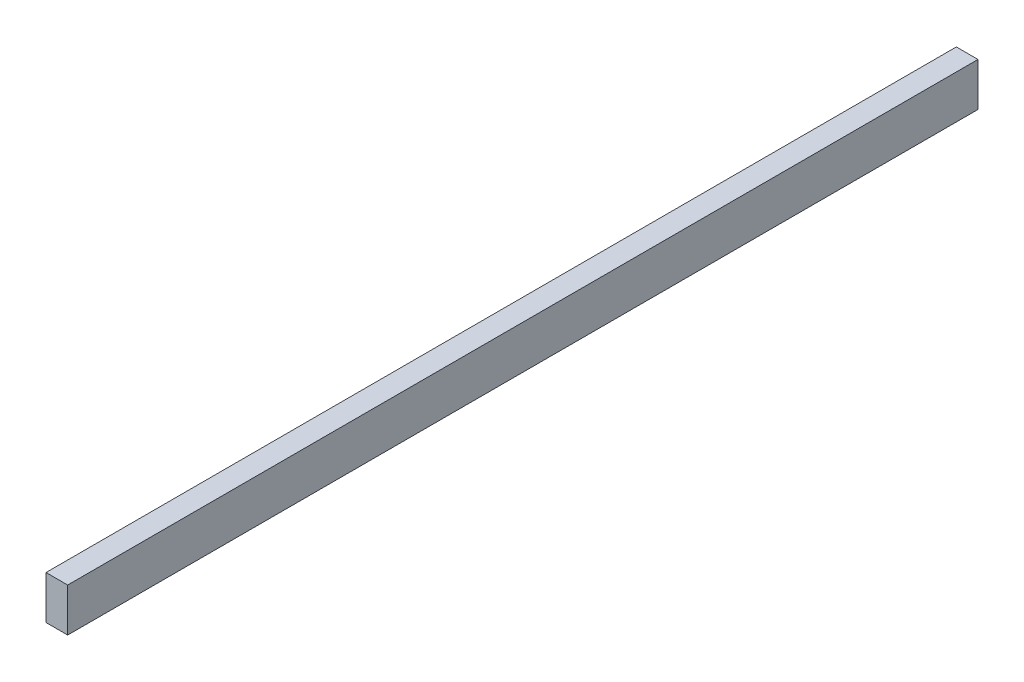
ISO-10303-21;
HEADER;
FILE_DESCRIPTION(('STEP AP214'),'2;1');
FILE_NAME('part.step','',(''),(''),'','','');
FILE_SCHEMA(('AUTOMOTIVE_DESIGN { 1 0 10303 214 1 1 1 1 }'));
ENDSEC;
DATA;
#1=APPLICATION_CONTEXT('core data for automotive mechanical design processes');
#2=APPLICATION_PROTOCOL_DEFINITION('international standard','automotive_design',2000,#1);
#3=PRODUCT_CONTEXT('',#1,'mechanical');
#4=PRODUCT('Part','Part','',(#3));
#5=PRODUCT_RELATED_PRODUCT_CATEGORY('part','',(#4));
#6=PRODUCT_DEFINITION_FORMATION('','',#4);
#7=PRODUCT_DEFINITION_CONTEXT('part definition',#1,'design');
#8=PRODUCT_DEFINITION('design','',#6,#7);
#9=PRODUCT_DEFINITION_SHAPE('','',#8);
#10=(LENGTH_UNIT() NAMED_UNIT(*) SI_UNIT(.MILLI.,.METRE.));
#11=(NAMED_UNIT(*) PLANE_ANGLE_UNIT() SI_UNIT($,.RADIAN.));
#12=(NAMED_UNIT(*) SI_UNIT($,.STERADIAN.) SOLID_ANGLE_UNIT());
#13=UNCERTAINTY_MEASURE_WITH_UNIT(LENGTH_MEASURE(1.E-05),#10,'distance_accuracy_value','');
#14=(GEOMETRIC_REPRESENTATION_CONTEXT(3) GLOBAL_UNCERTAINTY_ASSIGNED_CONTEXT((#13)) GLOBAL_UNIT_ASSIGNED_CONTEXT((#10,
#11,#12)) REPRESENTATION_CONTEXT('',''));
#15=CARTESIAN_POINT('',(0.,0.,0.));
#16=DIRECTION('',(0.,0.,1.));
#17=DIRECTION('',(1.,0.,0.));
#18=AXIS2_PLACEMENT_3D('',#15,#16,#17);
#19=CARTESIAN_POINT('',(25.4,-50.8,2133.6));
#20=DIRECTION('',(-1.,0.,0.));
#21=DIRECTION('',(0.,0.,1.));
#22=AXIS2_PLACEMENT_3D('',#19,#20,#21);
#23=PLANE('',#22);
#24=DIRECTION('',(0.,1.,0.));
#25=VECTOR('',#24,1.);
#26=CARTESIAN_POINT('',(25.4,-50.8,0.));
#27=LINE('',#26,#25);
#28=CARTESIAN_POINT('',(25.4,-50.8,0.));
#29=VERTEX_POINT('',#28);
#30=CARTESIAN_POINT('',(25.4,50.8,0.));
#31=VERTEX_POINT('',#30);
#32=EDGE_CURVE('E96',#29,#31,#27,.T.);
#33=ORIENTED_EDGE('',*,*,#32,.T.);
#34=DIRECTION('',(0.,0.,-1.));
#35=VECTOR('',#34,1.);
#36=CARTESIAN_POINT('',(25.4,50.8,2133.6));
#37=LINE('',#36,#35);
#38=CARTESIAN_POINT('',(25.4,50.8,2133.6));
#39=VERTEX_POINT('',#38);
#40=EDGE_CURVE('E11',#39,#31,#37,.T.);
#41=ORIENTED_EDGE('',*,*,#40,.F.);
#42=DIRECTION('',(0.,1.,0.));
#43=VECTOR('',#42,1.);
#44=CARTESIAN_POINT('',(25.4,-50.8,2133.6));
#45=LINE('',#44,#43);
#46=CARTESIAN_POINT('',(25.4,-50.8,2133.6));
#47=VERTEX_POINT('',#46);
#48=EDGE_CURVE('E84',#47,#39,#45,.T.);
#49=ORIENTED_EDGE('',*,*,#48,.F.);
#50=DIRECTION('',(0.,0.,-1.));
#51=VECTOR('',#50,1.);
#52=CARTESIAN_POINT('',(25.4,-50.8,2133.6));
#53=LINE('',#52,#51);
#54=EDGE_CURVE('E92',#47,#29,#53,.T.);
#55=ORIENTED_EDGE('',*,*,#54,.T.);
#56=EDGE_LOOP('',(#33,#41,#49,#55));
#57=FACE_BOUND('',#56,.T.);
#58=ADVANCED_FACE('F33',(#57),#23,.F.);
#59=CARTESIAN_POINT('',(-25.4,50.8,2133.6));
#60=DIRECTION('',(0.,-1.,0.));
#61=DIRECTION('',(0.,0.,-1.));
#62=AXIS2_PLACEMENT_3D('',#59,#60,#61);
#63=PLANE('',#62);
#64=DIRECTION('',(-1.,0.,0.));
#65=VECTOR('',#64,1.);
#66=CARTESIAN_POINT('',(-25.4,50.8,0.));
#67=LINE('',#66,#65);
#68=CARTESIAN_POINT('',(-25.4,50.8,0.));
#69=VERTEX_POINT('',#68);
#70=EDGE_CURVE('E88',#31,#69,#67,.T.);
#71=ORIENTED_EDGE('',*,*,#70,.T.);
#72=DIRECTION('',(0.,0.,-1.));
#73=VECTOR('',#72,1.);
#74=CARTESIAN_POINT('',(-25.4,50.8,2133.6));
#75=LINE('',#74,#73);
#76=CARTESIAN_POINT('',(-25.4,50.8,2133.6));
#77=VERTEX_POINT('',#76);
#78=EDGE_CURVE('E41',#77,#69,#75,.T.);
#79=ORIENTED_EDGE('',*,*,#78,.F.);
#80=DIRECTION('',(-1.,0.,0.));
#81=VECTOR('',#80,1.);
#82=CARTESIAN_POINT('',(-25.4,50.8,2133.6));
#83=LINE('',#82,#81);
#84=EDGE_CURVE('E79',#39,#77,#83,.T.);
#85=ORIENTED_EDGE('',*,*,#84,.F.);
#86=ORIENTED_EDGE('',*,*,#40,.T.);
#87=EDGE_LOOP('',(#71,#79,#85,#86));
#88=FACE_BOUND('',#87,.T.);
#89=ADVANCED_FACE('F87',(#88),#63,.F.);
#90=CARTESIAN_POINT('',(-25.4,-50.8,2133.6));
#91=DIRECTION('',(1.,0.,0.));
#92=DIRECTION('',(0.,0.,-1.));
#93=AXIS2_PLACEMENT_3D('',#90,#91,#92);
#94=PLANE('',#93);
#95=DIRECTION('',(0.,-1.,0.));
#96=VECTOR('',#95,1.);
#97=CARTESIAN_POINT('',(-25.4,-50.8,0.));
#98=LINE('',#97,#96);
#99=CARTESIAN_POINT('',(-25.4,-50.8,0.));
#100=VERTEX_POINT('',#99);
#101=EDGE_CURVE('E66',#69,#100,#98,.T.);
#102=ORIENTED_EDGE('',*,*,#101,.T.);
#103=DIRECTION('',(0.,0.,-1.));
#104=VECTOR('',#103,1.);
#105=CARTESIAN_POINT('',(-25.4,-50.8,2133.6));
#106=LINE('',#105,#104);
#107=CARTESIAN_POINT('',(-25.4,-50.8,2133.6));
#108=VERTEX_POINT('',#107);
#109=EDGE_CURVE('E89',#108,#100,#106,.T.);
#110=ORIENTED_EDGE('',*,*,#109,.F.);
#111=DIRECTION('',(0.,-1.,0.));
#112=VECTOR('',#111,1.);
#113=CARTESIAN_POINT('',(-25.4,-50.8,2133.6));
#114=LINE('',#113,#112);
#115=EDGE_CURVE('E82',#77,#108,#114,.T.);
#116=ORIENTED_EDGE('',*,*,#115,.F.);
#117=ORIENTED_EDGE('',*,*,#78,.T.);
#118=EDGE_LOOP('',(#102,#110,#116,#117));
#119=FACE_BOUND('',#118,.T.);
#120=ADVANCED_FACE('F90',(#119),#94,.F.);
#121=CARTESIAN_POINT('',(-25.4,-50.8,2133.6));
#122=DIRECTION('',(0.,1.,0.));
#123=DIRECTION('',(0.,0.,1.));
#124=AXIS2_PLACEMENT_3D('',#121,#122,#123);
#125=PLANE('',#124);
#126=DIRECTION('',(1.,0.,0.));
#127=VECTOR('',#126,1.);
#128=CARTESIAN_POINT('',(-25.4,-50.8,0.));
#129=LINE('',#128,#127);
#130=EDGE_CURVE('E72',#100,#29,#129,.T.);
#131=ORIENTED_EDGE('',*,*,#130,.T.);
#132=ORIENTED_EDGE('',*,*,#54,.F.);
#133=DIRECTION('',(1.,0.,0.));
#134=VECTOR('',#133,1.);
#135=CARTESIAN_POINT('',(-25.4,-50.8,2133.6));
#136=LINE('',#135,#134);
#137=EDGE_CURVE('E49',#108,#47,#136,.T.);
#138=ORIENTED_EDGE('',*,*,#137,.F.);
#139=ORIENTED_EDGE('',*,*,#109,.T.);
#140=EDGE_LOOP('',(#131,#132,#138,#139));
#141=FACE_BOUND('',#140,.T.);
#142=ADVANCED_FACE('F103',(#141),#125,.F.);
#143=CARTESIAN_POINT('',(0.,0.,2133.6));
#144=DIRECTION('',(0.,0.,-1.));
#145=DIRECTION('',(-1.,0.,0.));
#146=AXIS2_PLACEMENT_3D('',#143,#144,#145);
#147=PLANE('',#146);
#148=ORIENTED_EDGE('',*,*,#48,.T.);
#149=ORIENTED_EDGE('',*,*,#84,.T.);
#150=ORIENTED_EDGE('',*,*,#115,.T.);
#151=ORIENTED_EDGE('',*,*,#137,.T.);
#152=EDGE_LOOP('',(#148,#149,#150,#151));
#153=FACE_BOUND('',#152,.T.);
#154=ADVANCED_FACE('F80',(#153),#147,.F.);
#155=CARTESIAN_POINT('',(0.,0.,0.));
#156=DIRECTION('',(0.,0.,-1.));
#157=DIRECTION('',(-1.,0.,0.));
#158=AXIS2_PLACEMENT_3D('',#155,#156,#157);
#159=PLANE('',#158);
#160=ORIENTED_EDGE('',*,*,#32,.F.);
#161=ORIENTED_EDGE('',*,*,#130,.F.);
#162=ORIENTED_EDGE('',*,*,#101,.F.);
#163=ORIENTED_EDGE('',*,*,#70,.F.);
#164=EDGE_LOOP('',(#160,#161,#162,#163));
#165=FACE_BOUND('',#164,.T.);
#166=ADVANCED_FACE('F106',(#165),#159,.T.);
#167=CLOSED_SHELL('',(#58,#89,#120,#142,#154,#166));
#168=MANIFOLD_SOLID_BREP('B2',#167);
#169=ADVANCED_BREP_SHAPE_REPRESENTATION('',(#18,#168),#14);
#170=SHAPE_DEFINITION_REPRESENTATION(#9,#169);
ENDSEC;
END-ISO-10303-21;
